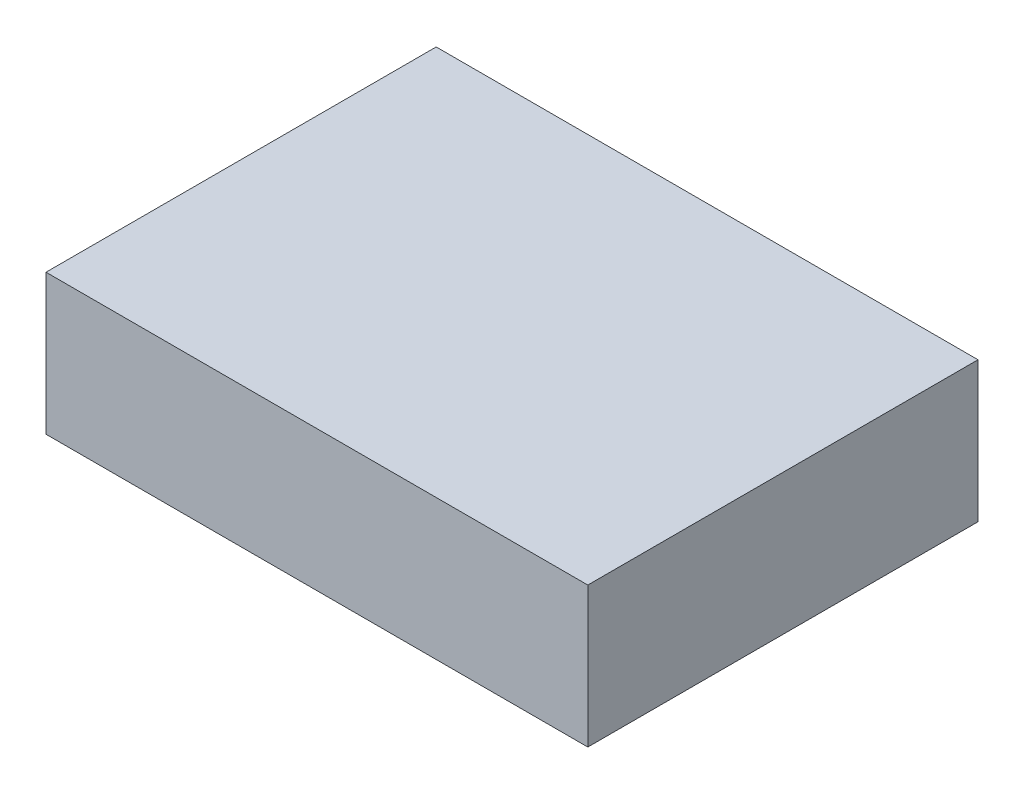
ISO-10303-21;
HEADER;
FILE_DESCRIPTION(('STEP AP214'),'2;1');
FILE_NAME('part.step','',(''),(''),'','','');
FILE_SCHEMA(('AUTOMOTIVE_DESIGN { 1 0 10303 214 1 1 1 1 }'));
ENDSEC;
DATA;
#1=APPLICATION_CONTEXT('core data for automotive mechanical design processes');
#2=APPLICATION_PROTOCOL_DEFINITION('international standard','automotive_design',2000,#1);
#3=PRODUCT_CONTEXT('',#1,'mechanical');
#4=PRODUCT('Part','Part','',(#3));
#5=PRODUCT_RELATED_PRODUCT_CATEGORY('part','',(#4));
#6=PRODUCT_DEFINITION_FORMATION('','',#4);
#7=PRODUCT_DEFINITION_CONTEXT('part definition',#1,'design');
#8=PRODUCT_DEFINITION('design','',#6,#7);
#9=PRODUCT_DEFINITION_SHAPE('','',#8);
#10=(LENGTH_UNIT() NAMED_UNIT(*) SI_UNIT(.MILLI.,.METRE.));
#11=(NAMED_UNIT(*) PLANE_ANGLE_UNIT() SI_UNIT($,.RADIAN.));
#12=(NAMED_UNIT(*) SI_UNIT($,.STERADIAN.) SOLID_ANGLE_UNIT());
#13=UNCERTAINTY_MEASURE_WITH_UNIT(LENGTH_MEASURE(1.E-05),#10,'distance_accuracy_value','');
#14=(GEOMETRIC_REPRESENTATION_CONTEXT(3) GLOBAL_UNCERTAINTY_ASSIGNED_CONTEXT((#13)) GLOBAL_UNIT_ASSIGNED_CONTEXT((#10,
#11,#12)) REPRESENTATION_CONTEXT('',''));
#15=CARTESIAN_POINT('',(0.,0.,0.));
#16=DIRECTION('',(0.,0.,1.));
#17=DIRECTION('',(1.,0.,0.));
#18=AXIS2_PLACEMENT_3D('',#15,#16,#17);
#19=CARTESIAN_POINT('',(0.,8.2,0.));
#20=DIRECTION('',(1.,0.,0.));
#21=DIRECTION('',(0.,0.,-1.));
#22=AXIS2_PLACEMENT_3D('',#19,#20,#21);
#23=PLANE('',#22);
#24=DIRECTION('',(0.,0.,1.));
#25=VECTOR('',#24,1.);
#26=CARTESIAN_POINT('',(0.,0.,0.));
#27=LINE('',#26,#25);
#28=CARTESIAN_POINT('',(0.,0.,-22.8));
#29=VERTEX_POINT('',#28);
#30=CARTESIAN_POINT('',(0.,0.,0.));
#31=VERTEX_POINT('',#30);
#32=EDGE_CURVE('E96',#29,#31,#27,.T.);
#33=ORIENTED_EDGE('',*,*,#32,.T.);
#34=DIRECTION('',(0.,-1.,0.));
#35=VECTOR('',#34,1.);
#36=CARTESIAN_POINT('',(0.,8.2,0.));
#37=LINE('',#36,#35);
#38=CARTESIAN_POINT('',(0.,8.2,0.));
#39=VERTEX_POINT('',#38);
#40=EDGE_CURVE('E11',#39,#31,#37,.T.);
#41=ORIENTED_EDGE('',*,*,#40,.F.);
#42=DIRECTION('',(0.,0.,1.));
#43=VECTOR('',#42,1.);
#44=CARTESIAN_POINT('',(0.,8.2,0.));
#45=LINE('',#44,#43);
#46=CARTESIAN_POINT('',(0.,8.2,-22.8));
#47=VERTEX_POINT('',#46);
#48=EDGE_CURVE('E84',#47,#39,#45,.T.);
#49=ORIENTED_EDGE('',*,*,#48,.F.);
#50=DIRECTION('',(0.,-1.,0.));
#51=VECTOR('',#50,1.);
#52=CARTESIAN_POINT('',(0.,8.2,-22.8));
#53=LINE('',#52,#51);
#54=EDGE_CURVE('E92',#47,#29,#53,.T.);
#55=ORIENTED_EDGE('',*,*,#54,.T.);
#56=EDGE_LOOP('',(#33,#41,#49,#55));
#57=FACE_BOUND('',#56,.T.);
#58=ADVANCED_FACE('F33',(#57),#23,.F.);
#59=CARTESIAN_POINT('',(0.,8.2,0.));
#60=DIRECTION('',(0.,0.,-1.));
#61=DIRECTION('',(-1.,0.,0.));
#62=AXIS2_PLACEMENT_3D('',#59,#60,#61);
#63=PLANE('',#62);
#64=DIRECTION('',(1.,0.,0.));
#65=VECTOR('',#64,1.);
#66=CARTESIAN_POINT('',(0.,0.,0.));
#67=LINE('',#66,#65);
#68=CARTESIAN_POINT('',(31.66,0.,0.));
#69=VERTEX_POINT('',#68);
#70=EDGE_CURVE('E88',#31,#69,#67,.T.);
#71=ORIENTED_EDGE('',*,*,#70,.T.);
#72=DIRECTION('',(0.,-1.,0.));
#73=VECTOR('',#72,1.);
#74=CARTESIAN_POINT('',(31.66,8.2,0.));
#75=LINE('',#74,#73);
#76=CARTESIAN_POINT('',(31.66,8.2,0.));
#77=VERTEX_POINT('',#76);
#78=EDGE_CURVE('E41',#77,#69,#75,.T.);
#79=ORIENTED_EDGE('',*,*,#78,.F.);
#80=DIRECTION('',(1.,0.,0.));
#81=VECTOR('',#80,1.);
#82=CARTESIAN_POINT('',(0.,8.2,0.));
#83=LINE('',#82,#81);
#84=EDGE_CURVE('E79',#39,#77,#83,.T.);
#85=ORIENTED_EDGE('',*,*,#84,.F.);
#86=ORIENTED_EDGE('',*,*,#40,.T.);
#87=EDGE_LOOP('',(#71,#79,#85,#86));
#88=FACE_BOUND('',#87,.T.);
#89=ADVANCED_FACE('F87',(#88),#63,.F.);
#90=CARTESIAN_POINT('',(31.66,8.2,0.));
#91=DIRECTION('',(-1.,0.,0.));
#92=DIRECTION('',(0.,0.,1.));
#93=AXIS2_PLACEMENT_3D('',#90,#91,#92);
#94=PLANE('',#93);
#95=DIRECTION('',(0.,0.,-1.));
#96=VECTOR('',#95,1.);
#97=CARTESIAN_POINT('',(31.66,0.,0.));
#98=LINE('',#97,#96);
#99=CARTESIAN_POINT('',(31.66,0.,-22.8));
#100=VERTEX_POINT('',#99);
#101=EDGE_CURVE('E66',#69,#100,#98,.T.);
#102=ORIENTED_EDGE('',*,*,#101,.T.);
#103=DIRECTION('',(0.,-1.,0.));
#104=VECTOR('',#103,1.);
#105=CARTESIAN_POINT('',(31.66,8.2,-22.8));
#106=LINE('',#105,#104);
#107=CARTESIAN_POINT('',(31.66,8.2,-22.8));
#108=VERTEX_POINT('',#107);
#109=EDGE_CURVE('E89',#108,#100,#106,.T.);
#110=ORIENTED_EDGE('',*,*,#109,.F.);
#111=DIRECTION('',(0.,0.,-1.));
#112=VECTOR('',#111,1.);
#113=CARTESIAN_POINT('',(31.66,8.2,0.));
#114=LINE('',#113,#112);
#115=EDGE_CURVE('E82',#77,#108,#114,.T.);
#116=ORIENTED_EDGE('',*,*,#115,.F.);
#117=ORIENTED_EDGE('',*,*,#78,.T.);
#118=EDGE_LOOP('',(#102,#110,#116,#117));
#119=FACE_BOUND('',#118,.T.);
#120=ADVANCED_FACE('F90',(#119),#94,.F.);
#121=CARTESIAN_POINT('',(0.,8.2,-22.8));
#122=DIRECTION('',(0.,0.,1.));
#123=DIRECTION('',(1.,0.,0.));
#124=AXIS2_PLACEMENT_3D('',#121,#122,#123);
#125=PLANE('',#124);
#126=DIRECTION('',(-1.,0.,0.));
#127=VECTOR('',#126,1.);
#128=CARTESIAN_POINT('',(0.,0.,-22.8));
#129=LINE('',#128,#127);
#130=EDGE_CURVE('E72',#100,#29,#129,.T.);
#131=ORIENTED_EDGE('',*,*,#130,.T.);
#132=ORIENTED_EDGE('',*,*,#54,.F.);
#133=DIRECTION('',(-1.,0.,0.));
#134=VECTOR('',#133,1.);
#135=CARTESIAN_POINT('',(0.,8.2,-22.8));
#136=LINE('',#135,#134);
#137=EDGE_CURVE('E49',#108,#47,#136,.T.);
#138=ORIENTED_EDGE('',*,*,#137,.F.);
#139=ORIENTED_EDGE('',*,*,#109,.T.);
#140=EDGE_LOOP('',(#131,#132,#138,#139));
#141=FACE_BOUND('',#140,.T.);
#142=ADVANCED_FACE('F103',(#141),#125,.F.);
#143=CARTESIAN_POINT('',(0.,8.2,0.));
#144=DIRECTION('',(0.,-1.,0.));
#145=DIRECTION('',(0.,0.,-1.));
#146=AXIS2_PLACEMENT_3D('',#143,#144,#145);
#147=PLANE('',#146);
#148=ORIENTED_EDGE('',*,*,#48,.T.);
#149=ORIENTED_EDGE('',*,*,#84,.T.);
#150=ORIENTED_EDGE('',*,*,#115,.T.);
#151=ORIENTED_EDGE('',*,*,#137,.T.);
#152=EDGE_LOOP('',(#148,#149,#150,#151));
#153=FACE_BOUND('',#152,.T.);
#154=ADVANCED_FACE('F80',(#153),#147,.F.);
#155=CARTESIAN_POINT('',(0.,0.,0.));
#156=DIRECTION('',(0.,-1.,0.));
#157=DIRECTION('',(0.,0.,-1.));
#158=AXIS2_PLACEMENT_3D('',#155,#156,#157);
#159=PLANE('',#158);
#160=ORIENTED_EDGE('',*,*,#32,.F.);
#161=ORIENTED_EDGE('',*,*,#130,.F.);
#162=ORIENTED_EDGE('',*,*,#101,.F.);
#163=ORIENTED_EDGE('',*,*,#70,.F.);
#164=EDGE_LOOP('',(#160,#161,#162,#163));
#165=FACE_BOUND('',#164,.T.);
#166=ADVANCED_FACE('F106',(#165),#159,.T.);
#167=CLOSED_SHELL('',(#58,#89,#120,#142,#154,#166));
#168=MANIFOLD_SOLID_BREP('B2',#167);
#169=ADVANCED_BREP_SHAPE_REPRESENTATION('',(#18,#168),#14);
#170=SHAPE_DEFINITION_REPRESENTATION(#9,#169);
ENDSEC;
END-ISO-10303-21;
